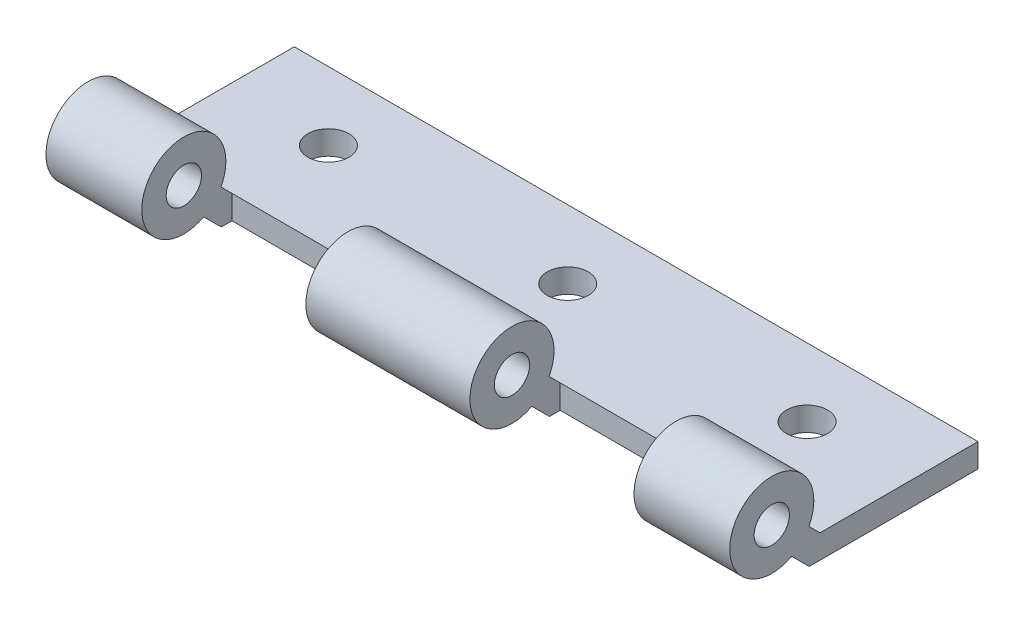
ISO-10303-21;
HEADER;
FILE_DESCRIPTION(('STEP AP214'),'2;1');
FILE_NAME('part.step','',(''),(''),'','','');
FILE_SCHEMA(('AUTOMOTIVE_DESIGN { 1 0 10303 214 1 1 1 1 }'));
ENDSEC;
DATA;
#1=APPLICATION_CONTEXT('core data for automotive mechanical design processes');
#2=APPLICATION_PROTOCOL_DEFINITION('international standard','automotive_design',2000,#1);
#3=PRODUCT_CONTEXT('',#1,'mechanical');
#4=PRODUCT('Part','Part','',(#3));
#5=PRODUCT_RELATED_PRODUCT_CATEGORY('part','',(#4));
#6=PRODUCT_DEFINITION_FORMATION('','',#4);
#7=PRODUCT_DEFINITION_CONTEXT('part definition',#1,'design');
#8=PRODUCT_DEFINITION('design','',#6,#7);
#9=PRODUCT_DEFINITION_SHAPE('','',#8);
#10=(LENGTH_UNIT() NAMED_UNIT(*) SI_UNIT(.MILLI.,.METRE.));
#11=(NAMED_UNIT(*) PLANE_ANGLE_UNIT() SI_UNIT($,.RADIAN.));
#12=(NAMED_UNIT(*) SI_UNIT($,.STERADIAN.) SOLID_ANGLE_UNIT());
#13=UNCERTAINTY_MEASURE_WITH_UNIT(LENGTH_MEASURE(1.E-05),#10,'distance_accuracy_value','');
#14=(GEOMETRIC_REPRESENTATION_CONTEXT(3) GLOBAL_UNCERTAINTY_ASSIGNED_CONTEXT((#13)) GLOBAL_UNIT_ASSIGNED_CONTEXT((#10,
#11,#12)) REPRESENTATION_CONTEXT('',''));
#15=CARTESIAN_POINT('',(0.,0.,0.));
#16=DIRECTION('',(0.,0.,1.));
#17=DIRECTION('',(1.,0.,0.));
#18=AXIS2_PLACEMENT_3D('',#15,#16,#17);
#19=CARTESIAN_POINT('',(50.0065,-8.,-5.47430296594927));
#20=DIRECTION('',(0.,0.707106781186546,-0.707106781186549));
#21=DIRECTION('',(0.,0.707106781186549,0.707106781186546));
#22=AXIS2_PLACEMENT_3D('',#19,#20,#21);
#23=PLANE('',#22);
#24=DIRECTION('',(0.,0.707106781186549,0.707106781186546));
#25=VECTOR('',#24,1.);
#26=CARTESIAN_POINT('',(-11.9935,-8.,-5.47430296594971));
#27=LINE('',#26,#25);
#28=CARTESIAN_POINT('',(-11.9935,-8.,-5.47430296594971));
#29=VERTEX_POINT('',#28);
#30=CARTESIAN_POINT('',(-11.9935,-5.42530863320071,-2.8996115991504));
#31=VERTEX_POINT('',#30);
#32=EDGE_CURVE('E364',#29,#31,#27,.T.);
#33=ORIENTED_EDGE('',*,*,#32,.F.);
#34=DIRECTION('',(-1.,0.,0.));
#35=VECTOR('',#34,1.);
#36=CARTESIAN_POINT('',(50.0065,-8.,-5.47430296594927));
#37=LINE('',#36,#35);
#38=CARTESIAN_POINT('',(12.0065,-8.,-5.47430296594927));
#39=VERTEX_POINT('',#38);
#40=EDGE_CURVE('E44',#39,#29,#37,.T.);
#41=ORIENTED_EDGE('',*,*,#40,.F.);
#42=DIRECTION('',(0.,-0.707106781186549,-0.707106781186546));
#43=VECTOR('',#42,1.);
#44=CARTESIAN_POINT('',(12.0065,-5.42530863320065,-2.89961159914993));
#45=LINE('',#44,#43);
#46=CARTESIAN_POINT('',(12.0065,-5.42530863320065,-2.89961159914993));
#47=VERTEX_POINT('',#46);
#48=EDGE_CURVE('E206',#47,#39,#45,.T.);
#49=ORIENTED_EDGE('',*,*,#48,.F.);
#50=DIRECTION('',(-1.,0.,0.));
#51=VECTOR('',#50,1.);
#52=CARTESIAN_POINT('',(50.0065,-5.42530863320065,-2.89961159914993));
#53=LINE('',#52,#51);
#54=EDGE_CURVE('E285',#47,#31,#53,.T.);
#55=ORIENTED_EDGE('',*,*,#54,.T.);
#56=EDGE_LOOP('',(#33,#41,#49,#55));
#57=FACE_BOUND('',#56,.T.);
#58=ADVANCED_FACE('F35',(#57),#23,.F.);
#59=CARTESIAN_POINT('',(50.0065,-2.89961159914995,-5.42530863320063));
#60=DIRECTION('',(0.,-0.707106781186546,0.707106781186549));
#61=DIRECTION('',(0.,-0.707106781186549,-0.707106781186546));
#62=AXIS2_PLACEMENT_3D('',#59,#60,#61);
#63=PLANE('',#62);
#64=DIRECTION('',(0.,-0.707106781186549,-0.707106781186546));
#65=VECTOR('',#64,1.);
#66=CARTESIAN_POINT('',(-11.9935,-2.89961159914995,-5.42530863320107));
#67=LINE('',#66,#65);
#68=CARTESIAN_POINT('',(-11.9935,-2.89961159914995,-5.42530863320107));
#69=VERTEX_POINT('',#68);
#70=CARTESIAN_POINT('',(-11.9934999999999,-4.5202,-7.04589703405067));
#71=VERTEX_POINT('',#70);
#72=EDGE_CURVE('E318',#69,#71,#67,.T.);
#73=ORIENTED_EDGE('',*,*,#72,.F.);
#74=DIRECTION('',(-1.,0.,0.));
#75=VECTOR('',#74,1.);
#76=CARTESIAN_POINT('',(50.0065,-2.89961159914995,-5.42530863320063));
#77=LINE('',#76,#75);
#78=CARTESIAN_POINT('',(12.0065,-2.89961159914995,-5.42530863320063));
#79=VERTEX_POINT('',#78);
#80=EDGE_CURVE('E290',#79,#69,#77,.T.);
#81=ORIENTED_EDGE('',*,*,#80,.F.);
#82=DIRECTION('',(0.,0.707106781186549,0.707106781186546));
#83=VECTOR('',#82,1.);
#84=CARTESIAN_POINT('',(12.0065,-2.89961159914995,-5.42530863320063));
#85=LINE('',#84,#83);
#86=CARTESIAN_POINT('',(12.0065,-4.5202,-7.04589703405067));
#87=VERTEX_POINT('',#86);
#88=EDGE_CURVE('E215',#87,#79,#85,.T.);
#89=ORIENTED_EDGE('',*,*,#88,.F.);
#90=DIRECTION('',(-1.,0.,0.));
#91=VECTOR('',#90,1.);
#92=CARTESIAN_POINT('',(50.0065,-4.5202,-7.04589703405067));
#93=LINE('',#92,#91);
#94=EDGE_CURVE('E293',#87,#71,#93,.T.);
#95=ORIENTED_EDGE('',*,*,#94,.T.);
#96=EDGE_LOOP('',(#73,#81,#89,#95));
#97=FACE_BOUND('',#96,.T.);
#98=ADVANCED_FACE('F316',(#97),#63,.F.);
#99=CARTESIAN_POINT('',(50.0065,0.,0.));
#100=DIRECTION('',(-1.,0.,0.));
#101=DIRECTION('',(0.,0.,1.));
#102=AXIS2_PLACEMENT_3D('',#99,#100,#101);
#103=CYLINDRICAL_SURFACE('',#102,6.1515625);
#104=CARTESIAN_POINT('',(-11.9935,0.,0.));
#105=DIRECTION('',(-1.,0.,0.));
#106=DIRECTION('',(0.,0.,1.));
#107=AXIS2_PLACEMENT_3D('',#104,#105,#106);
#108=CIRCLE('',#107,6.15156250000024);
#109=EDGE_CURVE('E355',#31,#69,#108,.T.);
#110=ORIENTED_EDGE('',*,*,#109,.F.);
#111=ORIENTED_EDGE('',*,*,#54,.F.);
#112=CARTESIAN_POINT('',(12.0065,0.,0.));
#113=DIRECTION('',(1.,0.,0.));
#114=DIRECTION('',(0.,0.,-1.));
#115=AXIS2_PLACEMENT_3D('',#112,#113,#114);
#116=CIRCLE('',#115,6.1515625);
#117=EDGE_CURVE('E204',#79,#47,#116,.T.);
#118=ORIENTED_EDGE('',*,*,#117,.F.);
#119=ORIENTED_EDGE('',*,*,#80,.T.);
#120=EDGE_LOOP('',(#110,#111,#118,#119));
#121=FACE_BOUND('',#120,.T.);
#122=ADVANCED_FACE('F354',(#121),#103,.T.);
#123=CARTESIAN_POINT('',(50.0065,0.,0.));
#124=DIRECTION('',(-1.,0.,0.));
#125=DIRECTION('',(0.,0.,1.));
#126=AXIS2_PLACEMENT_3D('',#123,#124,#125);
#127=CYLINDRICAL_SURFACE('',#126,2.5796875);
#128=CARTESIAN_POINT('',(12.0065,0.,0.));
#129=DIRECTION('',(1.,0.,0.));
#130=DIRECTION('',(0.,0.,-1.));
#131=AXIS2_PLACEMENT_3D('',#128,#129,#130);
#132=CIRCLE('',#131,2.5796875);
#133=CARTESIAN_POINT('',(12.0065,0.,-2.5796875));
#134=VERTEX_POINT('',#133);
#135=EDGE_CURVE('E183',#134,#134,#132,.T.);
#136=ORIENTED_EDGE('',*,*,#135,.T.);
#137=EDGE_LOOP('',(#136));
#138=FACE_BOUND('',#137,.T.);
#139=CARTESIAN_POINT('',(-11.9935,0.,0.));
#140=DIRECTION('',(-1.,0.,0.));
#141=DIRECTION('',(0.,0.,1.));
#142=AXIS2_PLACEMENT_3D('',#139,#140,#141);
#143=CIRCLE('',#142,2.5796875);
#144=CARTESIAN_POINT('',(-11.9935,0.,2.5796875));
#145=VERTEX_POINT('',#144);
#146=EDGE_CURVE('E187',#145,#145,#143,.T.);
#147=ORIENTED_EDGE('',*,*,#146,.T.);
#148=EDGE_LOOP('',(#147));
#149=FACE_BOUND('',#148,.T.);
#150=ADVANCED_FACE('F388',(#138,#149),#127,.F.);
#151=CARTESIAN_POINT('',(-35.9935,-8.,-5.47430296594987));
#152=VERTEX_POINT('',#151);
#153=CARTESIAN_POINT('',(-50.0065,-8.,-5.47430296594927));
#154=VERTEX_POINT('',#153);
#155=EDGE_CURVE('E46',#152,#154,#37,.T.);
#156=ORIENTED_EDGE('',*,*,#155,.F.);
#157=DIRECTION('',(0.,0.707106781186549,0.707106781186546));
#158=VECTOR('',#157,1.);
#159=CARTESIAN_POINT('',(-35.9935,-8.,-5.47430296594987));
#160=LINE('',#159,#158);
#161=CARTESIAN_POINT('',(-35.9935,-5.42530863320071,-2.89961159915056));
#162=VERTEX_POINT('',#161);
#163=EDGE_CURVE('E151',#152,#162,#160,.T.);
#164=ORIENTED_EDGE('',*,*,#163,.T.);
#165=CARTESIAN_POINT('',(-50.0065,-5.42530863320065,-2.89961159914993));
#166=VERTEX_POINT('',#165);
#167=EDGE_CURVE('E267',#162,#166,#53,.T.);
#168=ORIENTED_EDGE('',*,*,#167,.T.);
#169=DIRECTION('',(0.,-0.707106781186549,-0.707106781186546));
#170=VECTOR('',#169,1.);
#171=CARTESIAN_POINT('',(-50.0065,-8.,-5.47430296594927));
#172=LINE('',#171,#170);
#173=EDGE_CURVE('E172',#166,#154,#172,.T.);
#174=ORIENTED_EDGE('',*,*,#173,.T.);
#175=EDGE_LOOP('',(#156,#164,#168,#174));
#176=FACE_BOUND('',#175,.T.);
#177=ADVANCED_FACE('F170',(#176),#23,.F.);
#178=CARTESIAN_POINT('',(50.0065,-8.,-5.47430296594927));
#179=DIRECTION('',(0.,1.,0.));
#180=DIRECTION('',(0.,0.,1.));
#181=AXIS2_PLACEMENT_3D('',#178,#179,#180);
#182=PLANE('',#181);
#183=CARTESIAN_POINT('',(34.9935,-8.,-20.1625));
#184=DIRECTION('',(0.,1.,0.));
#185=DIRECTION('',(0.,0.,1.));
#186=AXIS2_PLACEMENT_3D('',#183,#184,#185);
#187=CIRCLE('',#186,3.);
#188=CARTESIAN_POINT('',(34.9935,-8.,-17.1625));
#189=VERTEX_POINT('',#188);
#190=EDGE_CURVE('E233',#189,#189,#187,.T.);
#191=ORIENTED_EDGE('',*,*,#190,.T.);
#192=EDGE_LOOP('',(#191));
#193=FACE_BOUND('',#192,.T.);
#194=CARTESIAN_POINT('',(-0.00649999999999956,-8.,-20.1625));
#195=DIRECTION('',(0.,1.,0.));
#196=DIRECTION('',(0.,0.,1.));
#197=AXIS2_PLACEMENT_3D('',#194,#195,#196);
#198=CIRCLE('',#197,3.);
#199=CARTESIAN_POINT('',(-0.00649999999999956,-8.,-17.1625));
#200=VERTEX_POINT('',#199);
#201=EDGE_CURVE('E241',#200,#200,#198,.T.);
#202=ORIENTED_EDGE('',*,*,#201,.T.);
#203=EDGE_LOOP('',(#202));
#204=FACE_BOUND('',#203,.T.);
#205=CARTESIAN_POINT('',(-35.0065,-8.,-20.1625));
#206=DIRECTION('',(0.,1.,0.));
#207=DIRECTION('',(0.,0.,1.));
#208=AXIS2_PLACEMENT_3D('',#205,#206,#207);
#209=CIRCLE('',#208,3.);
#210=CARTESIAN_POINT('',(-35.0065,-8.,-17.1625));
#211=VERTEX_POINT('',#210);
#212=EDGE_CURVE('E244',#211,#211,#209,.T.);
#213=ORIENTED_EDGE('',*,*,#212,.T.);
#214=EDGE_LOOP('',(#213));
#215=FACE_BOUND('',#214,.T.);
#216=DIRECTION('',(1.,0.,0.));
#217=VECTOR('',#216,1.);
#218=CARTESIAN_POINT('',(-35.9934999999999,-8.,-7.04589703405128));
#219=LINE('',#218,#217);
#220=CARTESIAN_POINT('',(-35.9934999999999,-8.,-7.04589703405128));
#221=VERTEX_POINT('',#220);
#222=CARTESIAN_POINT('',(-11.9934999999999,-8.,-7.04589703405111));
#223=VERTEX_POINT('',#222);
#224=EDGE_CURVE('E167',#221,#223,#219,.T.);
#225=ORIENTED_EDGE('',*,*,#224,.F.);
#226=DIRECTION('',(0.,0.,1.));
#227=VECTOR('',#226,1.);
#228=CARTESIAN_POINT('',(-35.9934999999999,-8.,-7.04589703405128));
#229=LINE('',#228,#227);
#230=EDGE_CURVE('E155',#221,#152,#229,.T.);
#231=ORIENTED_EDGE('',*,*,#230,.T.);
#232=ORIENTED_EDGE('',*,*,#155,.T.);
#233=DIRECTION('',(0.,0.,-1.));
#234=VECTOR('',#233,1.);
#235=CARTESIAN_POINT('',(-50.0065,-8.,-5.47430296594927));
#236=LINE('',#235,#234);
#237=CARTESIAN_POINT('',(-50.0065,-8.,-30.1625));
#238=VERTEX_POINT('',#237);
#239=EDGE_CURVE('E269',#154,#238,#236,.T.);
#240=ORIENTED_EDGE('',*,*,#239,.T.);
#241=DIRECTION('',(-1.,0.,0.));
#242=VECTOR('',#241,1.);
#243=CARTESIAN_POINT('',(50.0065,-8.,-30.1625));
#244=LINE('',#243,#242);
#245=CARTESIAN_POINT('',(50.0065,-8.,-30.1625));
#246=VERTEX_POINT('',#245);
#247=EDGE_CURVE('E173',#246,#238,#244,.T.);
#248=ORIENTED_EDGE('',*,*,#247,.F.);
#249=DIRECTION('',(0.,0.,-1.));
#250=VECTOR('',#249,1.);
#251=CARTESIAN_POINT('',(50.0065,-8.,-5.47430296594927));
#252=LINE('',#251,#250);
#253=CARTESIAN_POINT('',(50.0065,-8.,-5.47430296594927));
#254=VERTEX_POINT('',#253);
#255=EDGE_CURVE('E256',#254,#246,#252,.T.);
#256=ORIENTED_EDGE('',*,*,#255,.F.);
#257=CARTESIAN_POINT('',(36.0065,-8.,-5.47430296594927));
#258=VERTEX_POINT('',#257);
#259=EDGE_CURVE('E11',#254,#258,#37,.T.);
#260=ORIENTED_EDGE('',*,*,#259,.T.);
#261=DIRECTION('',(0.,0.,-1.));
#262=VECTOR('',#261,1.);
#263=CARTESIAN_POINT('',(36.0065,-8.,-7.04589703405067));
#264=LINE('',#263,#262);
#265=CARTESIAN_POINT('',(36.0065,-8.,-7.04589703405067));
#266=VERTEX_POINT('',#265);
#267=EDGE_CURVE('E220',#258,#266,#264,.T.);
#268=ORIENTED_EDGE('',*,*,#267,.T.);
#269=DIRECTION('',(1.,0.,0.));
#270=VECTOR('',#269,1.);
#271=CARTESIAN_POINT('',(12.0065,-8.,-7.04589703405067));
#272=LINE('',#271,#270);
#273=CARTESIAN_POINT('',(12.0065,-8.,-7.04589703405067));
#274=VERTEX_POINT('',#273);
#275=EDGE_CURVE('E217',#274,#266,#272,.T.);
#276=ORIENTED_EDGE('',*,*,#275,.F.);
#277=DIRECTION('',(0.,0.,-1.));
#278=VECTOR('',#277,1.);
#279=CARTESIAN_POINT('',(12.0065,-8.,-7.04589703405067));
#280=LINE('',#279,#278);
#281=EDGE_CURVE('E209',#39,#274,#280,.T.);
#282=ORIENTED_EDGE('',*,*,#281,.F.);
#283=ORIENTED_EDGE('',*,*,#40,.T.);
#284=DIRECTION('',(0.,0.,1.));
#285=VECTOR('',#284,1.);
#286=CARTESIAN_POINT('',(-11.9934999999999,-8.,-7.04589703405111));
#287=LINE('',#286,#285);
#288=EDGE_CURVE('E362',#223,#29,#287,.T.);
#289=ORIENTED_EDGE('',*,*,#288,.F.);
#290=EDGE_LOOP('',(#225,#231,#232,#240,#248,#256,#260,#268,#276,#282,#283,#289));
#291=FACE_BOUND('',#290,.T.);
#292=ADVANCED_FACE('F164',(#193,#204,#215,#291),#182,.F.);
#293=CARTESIAN_POINT('',(-35.9935,-2.89961159914995,-5.42530863320123));
#294=VERTEX_POINT('',#293);
#295=CARTESIAN_POINT('',(-50.0065,-2.89961159914995,-5.42530863320063));
#296=VERTEX_POINT('',#295);
#297=EDGE_CURVE('E284',#294,#296,#77,.T.);
#298=ORIENTED_EDGE('',*,*,#297,.F.);
#299=DIRECTION('',(0.,-0.707106781186549,-0.707106781186546));
#300=VECTOR('',#299,1.);
#301=CARTESIAN_POINT('',(-35.9935,-2.89961159914995,-5.42530863320123));
#302=LINE('',#301,#300);
#303=CARTESIAN_POINT('',(-35.9934999999999,-4.5202,-7.04589703405128));
#304=VERTEX_POINT('',#303);
#305=EDGE_CURVE('E312',#294,#304,#302,.T.);
#306=ORIENTED_EDGE('',*,*,#305,.T.);
#307=CARTESIAN_POINT('',(-50.0065,-4.5202,-7.04589703405067));
#308=VERTEX_POINT('',#307);
#309=EDGE_CURVE('E289',#304,#308,#93,.T.);
#310=ORIENTED_EDGE('',*,*,#309,.T.);
#311=DIRECTION('',(0.,0.707106781186549,0.707106781186546));
#312=VECTOR('',#311,1.);
#313=CARTESIAN_POINT('',(-50.0065,-2.89961159914995,-5.42530863320063));
#314=LINE('',#313,#312);
#315=EDGE_CURVE('E276',#308,#296,#314,.T.);
#316=ORIENTED_EDGE('',*,*,#315,.T.);
#317=EDGE_LOOP('',(#298,#306,#310,#316));
#318=FACE_BOUND('',#317,.T.);
#319=ADVANCED_FACE('F310',(#318),#63,.F.);
#320=ORIENTED_EDGE('',*,*,#167,.F.);
#321=CARTESIAN_POINT('',(-35.9935,0.,-2.51341267139301E-13));
#322=DIRECTION('',(-1.,0.,0.));
#323=DIRECTION('',(0.,0.,1.));
#324=AXIS2_PLACEMENT_3D('',#321,#322,#323);
#325=CIRCLE('',#324,6.15156250000024);
#326=EDGE_CURVE('E158',#162,#294,#325,.T.);
#327=ORIENTED_EDGE('',*,*,#326,.T.);
#328=ORIENTED_EDGE('',*,*,#297,.T.);
#329=CARTESIAN_POINT('',(-50.0065,0.,0.));
#330=DIRECTION('',(1.,0.,0.));
#331=DIRECTION('',(0.,0.,1.));
#332=AXIS2_PLACEMENT_3D('',#329,#330,#331);
#333=CIRCLE('',#332,6.1515625);
#334=EDGE_CURVE('E257',#296,#166,#333,.T.);
#335=ORIENTED_EDGE('',*,*,#334,.T.);
#336=EDGE_LOOP('',(#320,#327,#328,#335));
#337=FACE_BOUND('',#336,.T.);
#338=ADVANCED_FACE('F357',(#337),#103,.T.);
#339=CARTESIAN_POINT('',(-35.9935,0.,0.));
#340=DIRECTION('',(-1.,0.,0.));
#341=DIRECTION('',(0.,0.,1.));
#342=AXIS2_PLACEMENT_3D('',#339,#340,#341);
#343=CIRCLE('',#342,2.5796875);
#344=CARTESIAN_POINT('',(-35.9935,0.,2.5796875));
#345=VERTEX_POINT('',#344);
#346=EDGE_CURVE('E39',#345,#345,#343,.T.);
#347=ORIENTED_EDGE('',*,*,#346,.F.);
#348=EDGE_LOOP('',(#347));
#349=FACE_BOUND('',#348,.T.);
#350=CARTESIAN_POINT('',(-50.0065,0.,0.));
#351=DIRECTION('',(1.,0.,0.));
#352=DIRECTION('',(0.,0.,-1.));
#353=AXIS2_PLACEMENT_3D('',#350,#351,#352);
#354=CIRCLE('',#353,2.5796875);
#355=CARTESIAN_POINT('',(-50.0065,0.,-2.5796875));
#356=VERTEX_POINT('',#355);
#357=EDGE_CURVE('E247',#356,#356,#354,.T.);
#358=ORIENTED_EDGE('',*,*,#357,.F.);
#359=EDGE_LOOP('',(#358));
#360=FACE_BOUND('',#359,.T.);
#361=ADVANCED_FACE('F399',(#349,#360),#127,.F.);
#362=CARTESIAN_POINT('',(50.0065,0.,0.));
#363=DIRECTION('',(-1.,0.,0.));
#364=DIRECTION('',(0.,0.,1.));
#365=AXIS2_PLACEMENT_3D('',#362,#363,#364);
#366=PLANE('',#365);
#367=DIRECTION('',(0.,-0.707106781186549,-0.707106781186546));
#368=VECTOR('',#367,1.);
#369=CARTESIAN_POINT('',(50.0065,-8.,-5.47430296594927));
#370=LINE('',#369,#368);
#371=CARTESIAN_POINT('',(50.0065,-5.42530863320065,-2.89961159914993));
#372=VERTEX_POINT('',#371);
#373=EDGE_CURVE('E253',#372,#254,#370,.T.);
#374=ORIENTED_EDGE('',*,*,#373,.T.);
#375=ORIENTED_EDGE('',*,*,#255,.T.);
#376=DIRECTION('',(0.,1.,0.));
#377=VECTOR('',#376,1.);
#378=CARTESIAN_POINT('',(50.0065,-8.,-30.1625));
#379=LINE('',#378,#377);
#380=CARTESIAN_POINT('',(50.0065,-4.5202,-30.1625));
#381=VERTEX_POINT('',#380);
#382=EDGE_CURVE('E259',#246,#381,#379,.T.);
#383=ORIENTED_EDGE('',*,*,#382,.T.);
#384=DIRECTION('',(0.,0.,1.));
#385=VECTOR('',#384,1.);
#386=CARTESIAN_POINT('',(50.0065,-4.5202,-30.1625));
#387=LINE('',#386,#385);
#388=CARTESIAN_POINT('',(50.0065,-4.5202,-7.04589703405067));
#389=VERTEX_POINT('',#388);
#390=EDGE_CURVE('E261',#381,#389,#387,.T.);
#391=ORIENTED_EDGE('',*,*,#390,.T.);
#392=DIRECTION('',(0.,0.707106781186549,0.707106781186546));
#393=VECTOR('',#392,1.);
#394=CARTESIAN_POINT('',(50.0065,-2.89961159914995,-5.42530863320063));
#395=LINE('',#394,#393);
#396=CARTESIAN_POINT('',(50.0065,-2.89961159914995,-5.42530863320063));
#397=VERTEX_POINT('',#396);
#398=EDGE_CURVE('E263',#389,#397,#395,.T.);
#399=ORIENTED_EDGE('',*,*,#398,.T.);
#400=CARTESIAN_POINT('',(50.0065,0.,0.));
#401=DIRECTION('',(1.,0.,0.));
#402=DIRECTION('',(0.,0.,1.));
#403=AXIS2_PLACEMENT_3D('',#400,#401,#402);
#404=CIRCLE('',#403,6.1515625);
#405=EDGE_CURVE('E265',#397,#372,#404,.T.);
#406=ORIENTED_EDGE('',*,*,#405,.T.);
#407=EDGE_LOOP('',(#374,#375,#383,#391,#399,#406));
#408=FACE_BOUND('',#407,.T.);
#409=CARTESIAN_POINT('',(50.0065,0.,0.));
#410=DIRECTION('',(1.,0.,0.));
#411=DIRECTION('',(0.,0.,-1.));
#412=AXIS2_PLACEMENT_3D('',#409,#410,#411);
#413=CIRCLE('',#412,2.5796875);
#414=CARTESIAN_POINT('',(50.0065,0.,-2.5796875));
#415=VERTEX_POINT('',#414);
#416=EDGE_CURVE('E248',#415,#415,#413,.T.);
#417=ORIENTED_EDGE('',*,*,#416,.F.);
#418=EDGE_LOOP('',(#417));
#419=FACE_BOUND('',#418,.T.);
#420=ADVANCED_FACE('F328',(#408,#419),#366,.F.);
#421=CARTESIAN_POINT('',(-50.0065,0.,0.));
#422=DIRECTION('',(-1.,0.,0.));
#423=DIRECTION('',(0.,0.,1.));
#424=AXIS2_PLACEMENT_3D('',#421,#422,#423);
#425=PLANE('',#424);
#426=ORIENTED_EDGE('',*,*,#173,.F.);
#427=ORIENTED_EDGE('',*,*,#334,.F.);
#428=ORIENTED_EDGE('',*,*,#315,.F.);
#429=DIRECTION('',(0.,0.,1.));
#430=VECTOR('',#429,1.);
#431=CARTESIAN_POINT('',(-50.0065,-4.5202,-30.1625));
#432=LINE('',#431,#430);
#433=CARTESIAN_POINT('',(-50.0065,-4.5202,-30.1625));
#434=VERTEX_POINT('',#433);
#435=EDGE_CURVE('E273',#434,#308,#432,.T.);
#436=ORIENTED_EDGE('',*,*,#435,.F.);
#437=DIRECTION('',(0.,1.,0.));
#438=VECTOR('',#437,1.);
#439=CARTESIAN_POINT('',(-50.0065,-8.,-30.1625));
#440=LINE('',#439,#438);
#441=EDGE_CURVE('E271',#238,#434,#440,.T.);
#442=ORIENTED_EDGE('',*,*,#441,.F.);
#443=ORIENTED_EDGE('',*,*,#239,.F.);
#444=EDGE_LOOP('',(#426,#427,#428,#436,#442,#443));
#445=FACE_BOUND('',#444,.T.);
#446=ORIENTED_EDGE('',*,*,#357,.T.);
#447=EDGE_LOOP('',(#446));
#448=FACE_BOUND('',#447,.T.);
#449=ADVANCED_FACE('F305',(#445,#448),#425,.T.);
#450=CARTESIAN_POINT('',(36.0065,-5.42530863320065,-2.89961159914993));
#451=VERTEX_POINT('',#450);
#452=EDGE_CURVE('E281',#372,#451,#53,.T.);
#453=ORIENTED_EDGE('',*,*,#452,.T.);
#454=DIRECTION('',(0.,-0.707106781186549,-0.707106781186546));
#455=VECTOR('',#454,1.);
#456=CARTESIAN_POINT('',(36.0065,-5.42530863320065,-2.89961159914993));
#457=LINE('',#456,#455);
#458=EDGE_CURVE('E61',#451,#258,#457,.T.);
#459=ORIENTED_EDGE('',*,*,#458,.T.);
#460=ORIENTED_EDGE('',*,*,#259,.F.);
#461=ORIENTED_EDGE('',*,*,#373,.F.);
#462=EDGE_LOOP('',(#453,#459,#460,#461));
#463=FACE_BOUND('',#462,.T.);
#464=ADVANCED_FACE('F37',(#463),#23,.F.);
#465=CARTESIAN_POINT('',(50.0065,-8.,-30.1625));
#466=DIRECTION('',(0.,0.,1.));
#467=DIRECTION('',(1.,0.,0.));
#468=AXIS2_PLACEMENT_3D('',#465,#466,#467);
#469=PLANE('',#468);
#470=ORIENTED_EDGE('',*,*,#441,.T.);
#471=DIRECTION('',(-1.,0.,0.));
#472=VECTOR('',#471,1.);
#473=CARTESIAN_POINT('',(50.0065,-4.5202,-30.1625));
#474=LINE('',#473,#472);
#475=EDGE_CURVE('E176',#381,#434,#474,.T.);
#476=ORIENTED_EDGE('',*,*,#475,.F.);
#477=ORIENTED_EDGE('',*,*,#382,.F.);
#478=ORIENTED_EDGE('',*,*,#247,.T.);
#479=EDGE_LOOP('',(#470,#476,#477,#478));
#480=FACE_BOUND('',#479,.T.);
#481=ADVANCED_FACE('F332',(#480),#469,.F.);
#482=CARTESIAN_POINT('',(50.0065,-4.5202,-30.1625));
#483=DIRECTION('',(0.,-1.,0.));
#484=DIRECTION('',(0.,0.,-1.));
#485=AXIS2_PLACEMENT_3D('',#482,#483,#484);
#486=PLANE('',#485);
#487=CARTESIAN_POINT('',(-35.0065,-4.5202,-20.1625));
#488=DIRECTION('',(0.,1.,0.));
#489=DIRECTION('',(0.,0.,1.));
#490=AXIS2_PLACEMENT_3D('',#487,#488,#489);
#491=CIRCLE('',#490,3.);
#492=CARTESIAN_POINT('',(-35.0065,-4.5202,-17.1625));
#493=VERTEX_POINT('',#492);
#494=EDGE_CURVE('E230',#493,#493,#491,.T.);
#495=ORIENTED_EDGE('',*,*,#494,.F.);
#496=EDGE_LOOP('',(#495));
#497=FACE_BOUND('',#496,.T.);
#498=CARTESIAN_POINT('',(-0.00649999999999956,-4.5202,-20.1625));
#499=DIRECTION('',(0.,1.,0.));
#500=DIRECTION('',(0.,0.,1.));
#501=AXIS2_PLACEMENT_3D('',#498,#499,#500);
#502=CIRCLE('',#501,3.);
#503=CARTESIAN_POINT('',(-0.00649999999999956,-4.5202,-17.1625));
#504=VERTEX_POINT('',#503);
#505=EDGE_CURVE('E234',#504,#504,#502,.T.);
#506=ORIENTED_EDGE('',*,*,#505,.F.);
#507=EDGE_LOOP('',(#506));
#508=FACE_BOUND('',#507,.T.);
#509=CARTESIAN_POINT('',(34.9935,-4.5202,-20.1625));
#510=DIRECTION('',(0.,1.,0.));
#511=DIRECTION('',(0.,0.,1.));
#512=AXIS2_PLACEMENT_3D('',#509,#510,#511);
#513=CIRCLE('',#512,3.);
#514=CARTESIAN_POINT('',(34.9935,-4.5202,-17.1625));
#515=VERTEX_POINT('',#514);
#516=EDGE_CURVE('E186',#515,#515,#513,.T.);
#517=ORIENTED_EDGE('',*,*,#516,.F.);
#518=EDGE_LOOP('',(#517));
#519=FACE_BOUND('',#518,.T.);
#520=ORIENTED_EDGE('',*,*,#435,.T.);
#521=ORIENTED_EDGE('',*,*,#309,.F.);
#522=DIRECTION('',(1.,0.,0.));
#523=VECTOR('',#522,1.);
#524=CARTESIAN_POINT('',(-35.9934999999999,-4.5202,-7.04589703405128));
#525=LINE('',#524,#523);
#526=EDGE_CURVE('E189',#304,#71,#525,.T.);
#527=ORIENTED_EDGE('',*,*,#526,.T.);
#528=ORIENTED_EDGE('',*,*,#94,.F.);
#529=DIRECTION('',(1.,0.,0.));
#530=VECTOR('',#529,1.);
#531=CARTESIAN_POINT('',(12.0065,-4.5202,-7.04589703405067));
#532=LINE('',#531,#530);
#533=CARTESIAN_POINT('',(36.0065,-4.5202,-7.04589703405067));
#534=VERTEX_POINT('',#533);
#535=EDGE_CURVE('E184',#87,#534,#532,.T.);
#536=ORIENTED_EDGE('',*,*,#535,.T.);
#537=EDGE_CURVE('E291',#389,#534,#93,.T.);
#538=ORIENTED_EDGE('',*,*,#537,.F.);
#539=ORIENTED_EDGE('',*,*,#390,.F.);
#540=ORIENTED_EDGE('',*,*,#475,.T.);
#541=EDGE_LOOP('',(#520,#521,#527,#528,#536,#538,#539,#540));
#542=FACE_BOUND('',#541,.T.);
#543=ADVANCED_FACE('F298',(#497,#508,#519,#542),#486,.F.);
#544=ORIENTED_EDGE('',*,*,#537,.T.);
#545=DIRECTION('',(0.,0.707106781186549,0.707106781186546));
#546=VECTOR('',#545,1.);
#547=CARTESIAN_POINT('',(36.0065,-2.89961159914995,-5.42530863320063));
#548=LINE('',#547,#546);
#549=CARTESIAN_POINT('',(36.0065,-2.89961159914995,-5.42530863320063));
#550=VERTEX_POINT('',#549);
#551=EDGE_CURVE('E207',#534,#550,#548,.T.);
#552=ORIENTED_EDGE('',*,*,#551,.T.);
#553=EDGE_CURVE('E286',#397,#550,#77,.T.);
#554=ORIENTED_EDGE('',*,*,#553,.F.);
#555=ORIENTED_EDGE('',*,*,#398,.F.);
#556=EDGE_LOOP('',(#544,#552,#554,#555));
#557=FACE_BOUND('',#556,.T.);
#558=ADVANCED_FACE('F323',(#557),#63,.F.);
#559=ORIENTED_EDGE('',*,*,#553,.T.);
#560=CARTESIAN_POINT('',(36.0065,0.,0.));
#561=DIRECTION('',(1.,0.,0.));
#562=DIRECTION('',(0.,0.,-1.));
#563=AXIS2_PLACEMENT_3D('',#560,#561,#562);
#564=CIRCLE('',#563,6.1515625);
#565=EDGE_CURVE('E193',#550,#451,#564,.T.);
#566=ORIENTED_EDGE('',*,*,#565,.T.);
#567=ORIENTED_EDGE('',*,*,#452,.F.);
#568=ORIENTED_EDGE('',*,*,#405,.F.);
#569=EDGE_LOOP('',(#559,#566,#567,#568));
#570=FACE_BOUND('',#569,.T.);
#571=ADVANCED_FACE('F337',(#570),#103,.T.);
#572=CARTESIAN_POINT('',(36.0065,0.,0.));
#573=DIRECTION('',(1.,0.,0.));
#574=DIRECTION('',(0.,0.,-1.));
#575=AXIS2_PLACEMENT_3D('',#572,#573,#574);
#576=CIRCLE('',#575,2.5796875);
#577=CARTESIAN_POINT('',(36.0065,0.,-2.5796875));
#578=VERTEX_POINT('',#577);
#579=EDGE_CURVE('E180',#578,#578,#576,.T.);
#580=ORIENTED_EDGE('',*,*,#579,.F.);
#581=EDGE_LOOP('',(#580));
#582=FACE_BOUND('',#581,.T.);
#583=ORIENTED_EDGE('',*,*,#416,.T.);
#584=EDGE_LOOP('',(#583));
#585=FACE_BOUND('',#584,.T.);
#586=ADVANCED_FACE('F404',(#582,#585),#127,.F.);
#587=CARTESIAN_POINT('',(34.9935,-14.5202,-20.1625));
#588=DIRECTION('',(0.,1.,0.));
#589=DIRECTION('',(0.,0.,1.));
#590=AXIS2_PLACEMENT_3D('',#587,#588,#589);
#591=CYLINDRICAL_SURFACE('',#590,3.);
#592=ORIENTED_EDGE('',*,*,#516,.T.);
#593=EDGE_LOOP('',(#592));
#594=FACE_BOUND('',#593,.T.);
#595=ORIENTED_EDGE('',*,*,#190,.F.);
#596=EDGE_LOOP('',(#595));
#597=FACE_BOUND('',#596,.T.);
#598=ADVANCED_FACE('F430',(#594,#597),#591,.F.);
#599=CARTESIAN_POINT('',(-0.00649999999999956,-14.5202,-20.1625));
#600=DIRECTION('',(0.,1.,0.));
#601=DIRECTION('',(0.,0.,1.));
#602=AXIS2_PLACEMENT_3D('',#599,#600,#601);
#603=CYLINDRICAL_SURFACE('',#602,3.);
#604=ORIENTED_EDGE('',*,*,#505,.T.);
#605=EDGE_LOOP('',(#604));
#606=FACE_BOUND('',#605,.T.);
#607=ORIENTED_EDGE('',*,*,#201,.F.);
#608=EDGE_LOOP('',(#607));
#609=FACE_BOUND('',#608,.T.);
#610=ADVANCED_FACE('F422',(#606,#609),#603,.F.);
#611=CARTESIAN_POINT('',(-35.0065,-14.5202,-20.1625));
#612=DIRECTION('',(0.,1.,0.));
#613=DIRECTION('',(0.,0.,1.));
#614=AXIS2_PLACEMENT_3D('',#611,#612,#613);
#615=CYLINDRICAL_SURFACE('',#614,3.);
#616=ORIENTED_EDGE('',*,*,#494,.T.);
#617=EDGE_LOOP('',(#616));
#618=FACE_BOUND('',#617,.T.);
#619=ORIENTED_EDGE('',*,*,#212,.F.);
#620=EDGE_LOOP('',(#619));
#621=FACE_BOUND('',#620,.T.);
#622=ADVANCED_FACE('F420',(#618,#621),#615,.F.);
#623=CARTESIAN_POINT('',(12.0065,-4.5202,-7.04589703405067));
#624=DIRECTION('',(0.,0.,-1.));
#625=DIRECTION('',(-1.,0.,0.));
#626=AXIS2_PLACEMENT_3D('',#623,#624,#625);
#627=PLANE('',#626);
#628=DIRECTION('',(0.,1.,0.));
#629=VECTOR('',#628,1.);
#630=CARTESIAN_POINT('',(36.0065,-4.5202,-7.04589703405067));
#631=LINE('',#630,#629);
#632=EDGE_CURVE('E223',#266,#534,#631,.T.);
#633=ORIENTED_EDGE('',*,*,#632,.T.);
#634=ORIENTED_EDGE('',*,*,#535,.F.);
#635=DIRECTION('',(0.,1.,0.));
#636=VECTOR('',#635,1.);
#637=CARTESIAN_POINT('',(12.0065,-4.5202,-7.04589703405067));
#638=LINE('',#637,#636);
#639=EDGE_CURVE('E212',#274,#87,#638,.T.);
#640=ORIENTED_EDGE('',*,*,#639,.F.);
#641=ORIENTED_EDGE('',*,*,#275,.T.);
#642=EDGE_LOOP('',(#633,#634,#640,#641));
#643=FACE_BOUND('',#642,.T.);
#644=ADVANCED_FACE('F343',(#643),#627,.F.);
#645=CARTESIAN_POINT('',(12.0065,0.,0.));
#646=DIRECTION('',(1.,0.,0.));
#647=DIRECTION('',(0.,0.,-1.));
#648=AXIS2_PLACEMENT_3D('',#645,#646,#647);
#649=PLANE('',#648);
#650=ORIENTED_EDGE('',*,*,#135,.F.);
#651=EDGE_LOOP('',(#650));
#652=FACE_BOUND('',#651,.T.);
#653=ORIENTED_EDGE('',*,*,#117,.T.);
#654=ORIENTED_EDGE('',*,*,#48,.T.);
#655=ORIENTED_EDGE('',*,*,#281,.T.);
#656=ORIENTED_EDGE('',*,*,#639,.T.);
#657=ORIENTED_EDGE('',*,*,#88,.T.);
#658=EDGE_LOOP('',(#653,#654,#655,#656,#657));
#659=FACE_BOUND('',#658,.T.);
#660=ADVANCED_FACE('F345',(#652,#659),#649,.T.);
#661=CARTESIAN_POINT('',(36.0065,0.,0.));
#662=DIRECTION('',(1.,0.,0.));
#663=DIRECTION('',(0.,0.,-1.));
#664=AXIS2_PLACEMENT_3D('',#661,#662,#663);
#665=PLANE('',#664);
#666=ORIENTED_EDGE('',*,*,#579,.T.);
#667=EDGE_LOOP('',(#666));
#668=FACE_BOUND('',#667,.T.);
#669=ORIENTED_EDGE('',*,*,#565,.F.);
#670=ORIENTED_EDGE('',*,*,#551,.F.);
#671=ORIENTED_EDGE('',*,*,#632,.F.);
#672=ORIENTED_EDGE('',*,*,#267,.F.);
#673=ORIENTED_EDGE('',*,*,#458,.F.);
#674=EDGE_LOOP('',(#669,#670,#671,#672,#673));
#675=FACE_BOUND('',#674,.T.);
#676=ADVANCED_FACE('F338',(#668,#675),#665,.F.);
#677=CARTESIAN_POINT('',(-35.9934999999999,-4.5202,-7.04589703405128));
#678=DIRECTION('',(0.,0.,1.));
#679=DIRECTION('',(1.,0.,0.));
#680=AXIS2_PLACEMENT_3D('',#677,#678,#679);
#681=PLANE('',#680);
#682=DIRECTION('',(0.,-1.,0.));
#683=VECTOR('',#682,1.);
#684=CARTESIAN_POINT('',(-11.9934999999999,-4.5202,-7.04589703405111));
#685=LINE('',#684,#683);
#686=EDGE_CURVE('E53',#71,#223,#685,.T.);
#687=ORIENTED_EDGE('',*,*,#686,.F.);
#688=ORIENTED_EDGE('',*,*,#526,.F.);
#689=DIRECTION('',(0.,-1.,0.));
#690=VECTOR('',#689,1.);
#691=CARTESIAN_POINT('',(-35.9934999999999,-4.5202,-7.04589703405128));
#692=LINE('',#691,#690);
#693=EDGE_CURVE('E200',#304,#221,#692,.T.);
#694=ORIENTED_EDGE('',*,*,#693,.T.);
#695=ORIENTED_EDGE('',*,*,#224,.T.);
#696=EDGE_LOOP('',(#687,#688,#694,#695));
#697=FACE_BOUND('',#696,.T.);
#698=ADVANCED_FACE('F369',(#697),#681,.T.);
#699=CARTESIAN_POINT('',(-35.9935,0.,-2.51341267139301E-13));
#700=DIRECTION('',(-1.,0.,0.));
#701=DIRECTION('',(0.,0.,1.));
#702=AXIS2_PLACEMENT_3D('',#699,#700,#701);
#703=PLANE('',#702);
#704=ORIENTED_EDGE('',*,*,#346,.T.);
#705=EDGE_LOOP('',(#704));
#706=FACE_BOUND('',#705,.T.);
#707=ORIENTED_EDGE('',*,*,#230,.F.);
#708=ORIENTED_EDGE('',*,*,#693,.F.);
#709=ORIENTED_EDGE('',*,*,#305,.F.);
#710=ORIENTED_EDGE('',*,*,#326,.F.);
#711=ORIENTED_EDGE('',*,*,#163,.F.);
#712=EDGE_LOOP('',(#707,#708,#709,#710,#711));
#713=FACE_BOUND('',#712,.T.);
#714=ADVANCED_FACE('F153',(#706,#713),#703,.F.);
#715=CARTESIAN_POINT('',(-11.9935,0.,0.));
#716=DIRECTION('',(-1.,0.,0.));
#717=DIRECTION('',(0.,0.,1.));
#718=AXIS2_PLACEMENT_3D('',#715,#716,#717);
#719=PLANE('',#718);
#720=ORIENTED_EDGE('',*,*,#146,.F.);
#721=EDGE_LOOP('',(#720));
#722=FACE_BOUND('',#721,.T.);
#723=ORIENTED_EDGE('',*,*,#288,.T.);
#724=ORIENTED_EDGE('',*,*,#32,.T.);
#725=ORIENTED_EDGE('',*,*,#109,.T.);
#726=ORIENTED_EDGE('',*,*,#72,.T.);
#727=ORIENTED_EDGE('',*,*,#686,.T.);
#728=EDGE_LOOP('',(#723,#724,#725,#726,#727));
#729=FACE_BOUND('',#728,.T.);
#730=ADVANCED_FACE('F368',(#722,#729),#719,.T.);
#731=CLOSED_SHELL('',(#58,#98,#122,#150,#177,#292,#319,#338,#361,#420,#449,#464,#481,#543,#558,
#571,#586,#598,#610,#622,#644,#660,#676,#698,#714,#730));
#732=MANIFOLD_SOLID_BREP('B2',#731);
#733=ADVANCED_BREP_SHAPE_REPRESENTATION('',(#18,#732),#14);
#734=SHAPE_DEFINITION_REPRESENTATION(#9,#733);
ENDSEC;
END-ISO-10303-21;
